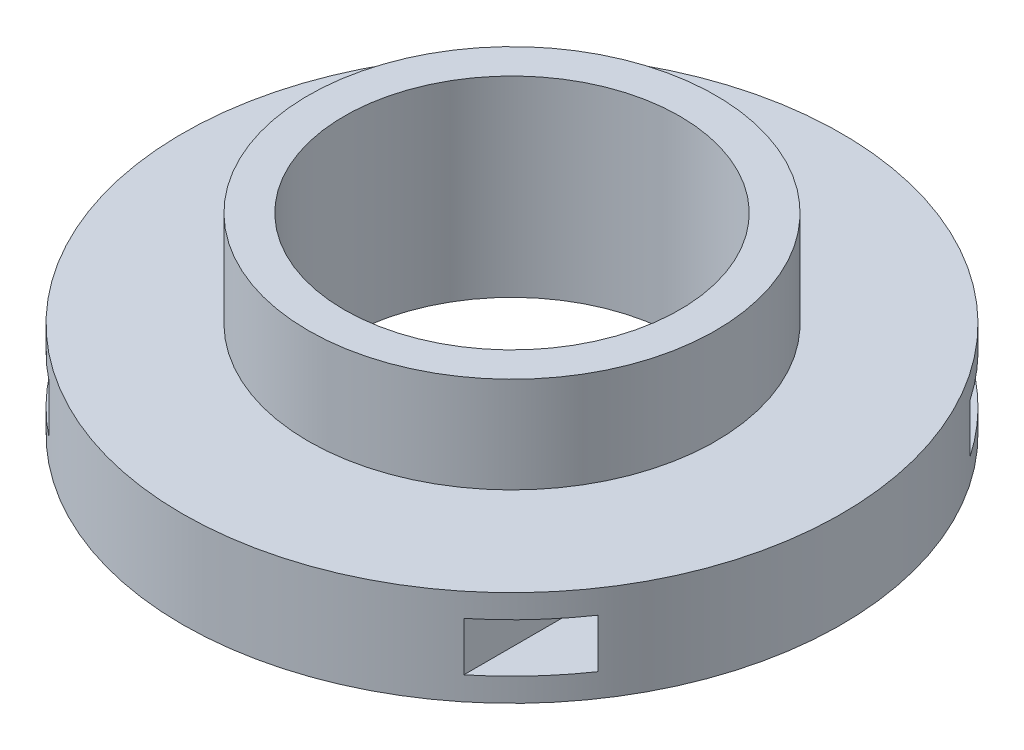
ISO-10303-21;
HEADER;
FILE_DESCRIPTION(('STEP AP214'),'2;1');
FILE_NAME('part.step','',(''),(''),'','','');
FILE_SCHEMA(('AUTOMOTIVE_DESIGN { 1 0 10303 214 1 1 1 1 }'));
ENDSEC;
DATA;
#1=APPLICATION_CONTEXT('core data for automotive mechanical design processes');
#2=APPLICATION_PROTOCOL_DEFINITION('international standard','automotive_design',2000,#1);
#3=PRODUCT_CONTEXT('',#1,'mechanical');
#4=PRODUCT('Part','Part','',(#3));
#5=PRODUCT_RELATED_PRODUCT_CATEGORY('part','',(#4));
#6=PRODUCT_DEFINITION_FORMATION('','',#4);
#7=PRODUCT_DEFINITION_CONTEXT('part definition',#1,'design');
#8=PRODUCT_DEFINITION('design','',#6,#7);
#9=PRODUCT_DEFINITION_SHAPE('','',#8);
#10=(LENGTH_UNIT() NAMED_UNIT(*) SI_UNIT(.MILLI.,.METRE.));
#11=(NAMED_UNIT(*) PLANE_ANGLE_UNIT() SI_UNIT($,.RADIAN.));
#12=(NAMED_UNIT(*) SI_UNIT($,.STERADIAN.) SOLID_ANGLE_UNIT());
#13=UNCERTAINTY_MEASURE_WITH_UNIT(LENGTH_MEASURE(1.E-05),#10,'distance_accuracy_value','');
#14=(GEOMETRIC_REPRESENTATION_CONTEXT(3) GLOBAL_UNCERTAINTY_ASSIGNED_CONTEXT((#13)) GLOBAL_UNIT_ASSIGNED_CONTEXT((#10,
#11,#12)) REPRESENTATION_CONTEXT('',''));
#15=CARTESIAN_POINT('',(0.,0.,0.));
#16=DIRECTION('',(0.,0.,1.));
#17=DIRECTION('',(1.,0.,0.));
#18=AXIS2_PLACEMENT_3D('',#15,#16,#17);
#19=CARTESIAN_POINT('',(0.,0.,0.));
#20=DIRECTION('',(0.,1.,0.));
#21=DIRECTION('',(0.,0.,1.));
#22=AXIS2_PLACEMENT_3D('',#19,#20,#21);
#23=PLANE('',#22);
#24=CARTESIAN_POINT('',(0.,0.,0.));
#25=DIRECTION('',(0.,1.,0.));
#26=DIRECTION('',(0.,0.,1.));
#27=AXIS2_PLACEMENT_3D('',#24,#25,#26);
#28=CIRCLE('',#27,13.75);
#29=CARTESIAN_POINT('',(0.,0.,13.75));
#30=VERTEX_POINT('',#29);
#31=EDGE_CURVE('E150',#30,#30,#28,.T.);
#32=ORIENTED_EDGE('',*,*,#31,.F.);
#33=EDGE_LOOP('',(#32));
#34=FACE_BOUND('',#33,.T.);
#35=CARTESIAN_POINT('',(0.,0.,0.));
#36=DIRECTION('',(0.,1.,0.));
#37=DIRECTION('',(0.,0.,1.));
#38=AXIS2_PLACEMENT_3D('',#35,#36,#37);
#39=CIRCLE('',#38,7.);
#40=CARTESIAN_POINT('',(0.,0.,7.));
#41=VERTEX_POINT('',#40);
#42=EDGE_CURVE('E131',#41,#41,#39,.T.);
#43=ORIENTED_EDGE('',*,*,#42,.T.);
#44=EDGE_LOOP('',(#43));
#45=FACE_BOUND('',#44,.T.);
#46=ADVANCED_FACE('F33',(#34,#45),#23,.F.);
#47=CARTESIAN_POINT('',(0.,7.99999999999999,0.));
#48=DIRECTION('',(0.,1.,0.));
#49=DIRECTION('',(0.,0.,1.));
#50=AXIS2_PLACEMENT_3D('',#47,#48,#49);
#51=PLANE('',#50);
#52=CARTESIAN_POINT('',(0.,7.99999999999999,0.));
#53=DIRECTION('',(0.,1.,0.));
#54=DIRECTION('',(0.,0.,1.));
#55=AXIS2_PLACEMENT_3D('',#52,#53,#54);
#56=CIRCLE('',#55,8.5);
#57=CARTESIAN_POINT('',(0.,7.99999999999999,8.5));
#58=VERTEX_POINT('',#57);
#59=EDGE_CURVE('E147',#58,#58,#56,.T.);
#60=ORIENTED_EDGE('',*,*,#59,.T.);
#61=EDGE_LOOP('',(#60));
#62=FACE_BOUND('',#61,.T.);
#63=CARTESIAN_POINT('',(0.,7.99999999999999,0.));
#64=DIRECTION('',(0.,1.,0.));
#65=DIRECTION('',(0.,0.,1.));
#66=AXIS2_PLACEMENT_3D('',#63,#64,#65);
#67=CIRCLE('',#66,7.);
#68=CARTESIAN_POINT('',(0.,7.99999999999999,7.));
#69=VERTEX_POINT('',#68);
#70=EDGE_CURVE('E37',#69,#69,#67,.F.);
#71=ORIENTED_EDGE('',*,*,#70,.T.);
#72=EDGE_LOOP('',(#71));
#73=FACE_BOUND('',#72,.T.);
#74=ADVANCED_FACE('F203',(#62,#73),#51,.T.);
#75=CARTESIAN_POINT('',(0.,4.,0.));
#76=DIRECTION('',(0.,1.,0.));
#77=DIRECTION('',(0.,0.,1.));
#78=AXIS2_PLACEMENT_3D('',#75,#76,#77);
#79=PLANE('',#78);
#80=CARTESIAN_POINT('',(0.,4.,0.));
#81=DIRECTION('',(0.,1.,0.));
#82=DIRECTION('',(0.,0.,1.));
#83=AXIS2_PLACEMENT_3D('',#80,#81,#82);
#84=CIRCLE('',#83,13.75);
#85=CARTESIAN_POINT('',(0.,4.,13.75));
#86=VERTEX_POINT('',#85);
#87=EDGE_CURVE('E153',#86,#86,#84,.T.);
#88=ORIENTED_EDGE('',*,*,#87,.T.);
#89=EDGE_LOOP('',(#88));
#90=FACE_BOUND('',#89,.T.);
#91=CARTESIAN_POINT('',(0.,4.,0.));
#92=DIRECTION('',(0.,1.,0.));
#93=DIRECTION('',(0.,0.,1.));
#94=AXIS2_PLACEMENT_3D('',#91,#92,#93);
#95=CIRCLE('',#94,8.5);
#96=CARTESIAN_POINT('',(0.,4.,8.5));
#97=VERTEX_POINT('',#96);
#98=EDGE_CURVE('E137',#97,#97,#95,.T.);
#99=ORIENTED_EDGE('',*,*,#98,.F.);
#100=EDGE_LOOP('',(#99));
#101=FACE_BOUND('',#100,.T.);
#102=ADVANCED_FACE('F208',(#90,#101),#79,.T.);
#103=CARTESIAN_POINT('',(0.,4.,0.));
#104=DIRECTION('',(0.,-1.,0.));
#105=DIRECTION('',(0.,0.,-1.));
#106=AXIS2_PLACEMENT_3D('',#103,#104,#105);
#107=CYLINDRICAL_SURFACE('',#106,13.75);
#108=CARTESIAN_POINT('',(0.,3.01991177809444,0.));
#109=DIRECTION('',(0.,1.,0.));
#110=DIRECTION('',(0.,0.,1.));
#111=AXIS2_PLACEMENT_3D('',#108,#109,#110);
#112=CIRCLE('',#111,13.75);
#113=CARTESIAN_POINT('',(11.3483899378538,3.01991177809444,-7.76379712630482));
#114=VERTEX_POINT('',#113);
#115=CARTESIAN_POINT('',(8.66604322527016,3.01991177809444,-10.6753077153658));
#116=VERTEX_POINT('',#115);
#117=EDGE_CURVE('E42',#114,#116,#112,.T.);
#118=ORIENTED_EDGE('',*,*,#117,.T.);
#119=DIRECTION('',(0.,-1.,0.));
#120=VECTOR('',#119,1.);
#121=CARTESIAN_POINT('',(8.66604322527016,4.,-10.6753077153658));
#122=LINE('',#121,#120);
#123=CARTESIAN_POINT('',(8.66604322527016,0.980088221905557,-10.6753077153658));
#124=VERTEX_POINT('',#123);
#125=EDGE_CURVE('E11',#116,#124,#122,.T.);
#126=ORIENTED_EDGE('',*,*,#125,.T.);
#127=CARTESIAN_POINT('',(0.,0.980088221905557,0.));
#128=DIRECTION('',(0.,-1.,0.));
#129=DIRECTION('',(0.,0.,-1.));
#130=AXIS2_PLACEMENT_3D('',#127,#128,#129);
#131=CIRCLE('',#130,13.75);
#132=CARTESIAN_POINT('',(11.3483899378538,0.980088221905557,-7.76379712630482));
#133=VERTEX_POINT('',#132);
#134=EDGE_CURVE('E104',#124,#133,#131,.T.);
#135=ORIENTED_EDGE('',*,*,#134,.T.);
#136=DIRECTION('',(0.,-1.,0.));
#137=VECTOR('',#136,1.);
#138=CARTESIAN_POINT('',(11.3483899378538,4.,-7.76379712630482));
#139=LINE('',#138,#137);
#140=EDGE_CURVE('E110',#133,#114,#139,.F.);
#141=ORIENTED_EDGE('',*,*,#140,.T.);
#142=EDGE_LOOP('',(#118,#126,#135,#141));
#143=FACE_BOUND('',#142,.T.);
#144=CARTESIAN_POINT('',(11.3483899378538,0.980088221905557,7.76379712630482));
#145=VERTEX_POINT('',#144);
#146=CARTESIAN_POINT('',(8.66604322527016,0.980088221905557,10.6753077153658));
#147=VERTEX_POINT('',#146);
#148=EDGE_CURVE('E96',#145,#147,#131,.T.);
#149=ORIENTED_EDGE('',*,*,#148,.T.);
#150=DIRECTION('',(0.,-1.,0.));
#151=VECTOR('',#150,1.);
#152=CARTESIAN_POINT('',(8.66604322527016,4.,10.6753077153658));
#153=LINE('',#152,#151);
#154=CARTESIAN_POINT('',(8.66604322527016,3.01991177809444,10.6753077153658));
#155=VERTEX_POINT('',#154);
#156=EDGE_CURVE('E118',#147,#155,#153,.F.);
#157=ORIENTED_EDGE('',*,*,#156,.T.);
#158=CARTESIAN_POINT('',(11.3483899378538,3.01991177809444,7.76379712630482));
#159=VERTEX_POINT('',#158);
#160=EDGE_CURVE('E116',#155,#159,#112,.T.);
#161=ORIENTED_EDGE('',*,*,#160,.T.);
#162=DIRECTION('',(0.,-1.,0.));
#163=VECTOR('',#162,1.);
#164=CARTESIAN_POINT('',(11.3483899378538,4.,7.76379712630482));
#165=LINE('',#164,#163);
#166=EDGE_CURVE('E101',#159,#145,#165,.T.);
#167=ORIENTED_EDGE('',*,*,#166,.T.);
#168=EDGE_LOOP('',(#149,#157,#161,#167));
#169=FACE_BOUND('',#168,.T.);
#170=CARTESIAN_POINT('',(0.,0.980088221905557,0.));
#171=DIRECTION('',(0.,-1.,0.));
#172=DIRECTION('',(0.,0.,-1.));
#173=AXIS2_PLACEMENT_3D('',#170,#171,#172);
#174=CIRCLE('',#173,13.75);
#175=CARTESIAN_POINT('',(-11.3999735284804,0.980088221905557,-7.68785428776757));
#176=VERTEX_POINT('',#175);
#177=CARTESIAN_POINT('',(-8.51129245339033,0.980088221905557,-10.7990925902532));
#178=VERTEX_POINT('',#177);
#179=EDGE_CURVE('E169',#176,#178,#174,.T.);
#180=ORIENTED_EDGE('',*,*,#179,.T.);
#181=DIRECTION('',(0.,-1.,0.));
#182=VECTOR('',#181,1.);
#183=CARTESIAN_POINT('',(-8.51129245339033,4.,-10.7990925902532));
#184=LINE('',#183,#182);
#185=CARTESIAN_POINT('',(-8.51129245339033,3.01991177809444,-10.7990925902532));
#186=VERTEX_POINT('',#185);
#187=EDGE_CURVE('E102',#178,#186,#184,.F.);
#188=ORIENTED_EDGE('',*,*,#187,.T.);
#189=CARTESIAN_POINT('',(0.,3.01991177809444,0.));
#190=DIRECTION('',(0.,1.,0.));
#191=DIRECTION('',(0.,0.,1.));
#192=AXIS2_PLACEMENT_3D('',#189,#190,#191);
#193=CIRCLE('',#192,13.75);
#194=CARTESIAN_POINT('',(-11.3999735284804,3.01991177809444,-7.68785428776757));
#195=VERTEX_POINT('',#194);
#196=EDGE_CURVE('E162',#186,#195,#193,.T.);
#197=ORIENTED_EDGE('',*,*,#196,.T.);
#198=DIRECTION('',(0.,-1.,0.));
#199=VECTOR('',#198,1.);
#200=CARTESIAN_POINT('',(-11.3999735284804,4.,-7.68785428776757));
#201=LINE('',#200,#199);
#202=EDGE_CURVE('E172',#195,#176,#201,.T.);
#203=ORIENTED_EDGE('',*,*,#202,.T.);
#204=EDGE_LOOP('',(#180,#188,#197,#203));
#205=FACE_BOUND('',#204,.T.);
#206=CARTESIAN_POINT('',(-11.3999735284804,3.01991177809444,7.68785428776757));
#207=VERTEX_POINT('',#206);
#208=CARTESIAN_POINT('',(-8.51129245339033,3.01991177809444,10.7990925902532));
#209=VERTEX_POINT('',#208);
#210=EDGE_CURVE('E156',#207,#209,#193,.T.);
#211=ORIENTED_EDGE('',*,*,#210,.T.);
#212=DIRECTION('',(0.,-1.,0.));
#213=VECTOR('',#212,1.);
#214=CARTESIAN_POINT('',(-8.51129245339033,4.,10.7990925902532));
#215=LINE('',#214,#213);
#216=CARTESIAN_POINT('',(-8.51129245339033,0.980088221905557,10.7990925902532));
#217=VERTEX_POINT('',#216);
#218=EDGE_CURVE('E168',#209,#217,#215,.T.);
#219=ORIENTED_EDGE('',*,*,#218,.T.);
#220=CARTESIAN_POINT('',(-11.3999735284804,0.980088221905557,7.68785428776757));
#221=VERTEX_POINT('',#220);
#222=EDGE_CURVE('E165',#217,#221,#174,.T.);
#223=ORIENTED_EDGE('',*,*,#222,.T.);
#224=DIRECTION('',(0.,-1.,0.));
#225=VECTOR('',#224,1.);
#226=CARTESIAN_POINT('',(-11.3999735284804,4.,7.68785428776757));
#227=LINE('',#226,#225);
#228=EDGE_CURVE('E161',#221,#207,#227,.F.);
#229=ORIENTED_EDGE('',*,*,#228,.T.);
#230=EDGE_LOOP('',(#211,#219,#223,#229));
#231=FACE_BOUND('',#230,.T.);
#232=ORIENTED_EDGE('',*,*,#87,.F.);
#233=EDGE_LOOP('',(#232));
#234=FACE_BOUND('',#233,.T.);
#235=ORIENTED_EDGE('',*,*,#31,.T.);
#236=EDGE_LOOP('',(#235));
#237=FACE_BOUND('',#236,.T.);
#238=ADVANCED_FACE('F35',(#143,#169,#205,#231,#234,#237),#107,.T.);
#239=CARTESIAN_POINT('',(0.,7.99999999999999,0.));
#240=DIRECTION('',(0.,-1.,0.));
#241=DIRECTION('',(0.,0.,-1.));
#242=AXIS2_PLACEMENT_3D('',#239,#240,#241);
#243=CYLINDRICAL_SURFACE('',#242,8.5);
#244=ORIENTED_EDGE('',*,*,#59,.F.);
#245=EDGE_LOOP('',(#244));
#246=FACE_BOUND('',#245,.T.);
#247=ORIENTED_EDGE('',*,*,#98,.T.);
#248=EDGE_LOOP('',(#247));
#249=FACE_BOUND('',#248,.T.);
#250=ADVANCED_FACE('F217',(#246,#249),#243,.T.);
#251=CARTESIAN_POINT('',(-8.51129245339033,0.980088221905557,-13.75));
#252=DIRECTION('',(1.,0.,0.));
#253=DIRECTION('',(0.,0.,-1.));
#254=AXIS2_PLACEMENT_3D('',#251,#252,#253);
#255=PLANE('',#254);
#256=DIRECTION('',(0.,0.,1.));
#257=VECTOR('',#256,1.);
#258=CARTESIAN_POINT('',(-8.51129245339033,3.01991177809444,-13.75));
#259=LINE('',#258,#257);
#260=EDGE_CURVE('E144',#186,#209,#259,.T.);
#261=ORIENTED_EDGE('',*,*,#260,.F.);
#262=ORIENTED_EDGE('',*,*,#187,.F.);
#263=DIRECTION('',(0.,0.,1.));
#264=VECTOR('',#263,1.);
#265=CARTESIAN_POINT('',(-8.51129245339033,0.980088221905557,-13.75));
#266=LINE('',#265,#264);
#267=EDGE_CURVE('E134',#178,#217,#266,.T.);
#268=ORIENTED_EDGE('',*,*,#267,.T.);
#269=ORIENTED_EDGE('',*,*,#218,.F.);
#270=EDGE_LOOP('',(#261,#262,#268,#269));
#271=FACE_BOUND('',#270,.T.);
#272=ADVANCED_FACE('F189',(#271),#255,.F.);
#273=CARTESIAN_POINT('',(-11.3999735284804,0.980088221905557,-13.75));
#274=DIRECTION('',(0.,-1.,0.));
#275=DIRECTION('',(0.,0.,-1.));
#276=AXIS2_PLACEMENT_3D('',#273,#274,#275);
#277=PLANE('',#276);
#278=ORIENTED_EDGE('',*,*,#267,.F.);
#279=ORIENTED_EDGE('',*,*,#179,.F.);
#280=DIRECTION('',(0.,0.,1.));
#281=VECTOR('',#280,1.);
#282=CARTESIAN_POINT('',(-11.3999735284804,0.980088221905557,-13.75));
#283=LINE('',#282,#281);
#284=EDGE_CURVE('E138',#176,#221,#283,.T.);
#285=ORIENTED_EDGE('',*,*,#284,.T.);
#286=ORIENTED_EDGE('',*,*,#222,.F.);
#287=EDGE_LOOP('',(#278,#279,#285,#286));
#288=FACE_BOUND('',#287,.T.);
#289=ADVANCED_FACE('F182',(#288),#277,.F.);
#290=CARTESIAN_POINT('',(-11.3999735284804,0.980088221905557,-13.75));
#291=DIRECTION('',(-1.,0.,0.));
#292=DIRECTION('',(0.,0.,1.));
#293=AXIS2_PLACEMENT_3D('',#290,#291,#292);
#294=PLANE('',#293);
#295=DIRECTION('',(0.,0.,1.));
#296=VECTOR('',#295,1.);
#297=CARTESIAN_POINT('',(-11.3999735284804,3.01991177809444,-13.75));
#298=LINE('',#297,#296);
#299=EDGE_CURVE('E141',#195,#207,#298,.T.);
#300=ORIENTED_EDGE('',*,*,#299,.T.);
#301=ORIENTED_EDGE('',*,*,#228,.F.);
#302=ORIENTED_EDGE('',*,*,#284,.F.);
#303=ORIENTED_EDGE('',*,*,#202,.F.);
#304=EDGE_LOOP('',(#300,#301,#302,#303));
#305=FACE_BOUND('',#304,.T.);
#306=ADVANCED_FACE('F184',(#305),#294,.F.);
#307=CARTESIAN_POINT('',(-11.3999735284804,3.01991177809444,-13.75));
#308=DIRECTION('',(0.,1.,0.));
#309=DIRECTION('',(0.,0.,1.));
#310=AXIS2_PLACEMENT_3D('',#307,#308,#309);
#311=PLANE('',#310);
#312=ORIENTED_EDGE('',*,*,#260,.T.);
#313=ORIENTED_EDGE('',*,*,#210,.F.);
#314=ORIENTED_EDGE('',*,*,#299,.F.);
#315=ORIENTED_EDGE('',*,*,#196,.F.);
#316=EDGE_LOOP('',(#312,#313,#314,#315));
#317=FACE_BOUND('',#316,.T.);
#318=ADVANCED_FACE('F191',(#317),#311,.F.);
#319=CARTESIAN_POINT('',(8.66604322527016,0.980088221905557,-13.75));
#320=DIRECTION('',(-1.,0.,0.));
#321=DIRECTION('',(0.,0.,1.));
#322=AXIS2_PLACEMENT_3D('',#319,#320,#321);
#323=PLANE('',#322);
#324=DIRECTION('',(0.,0.,1.));
#325=VECTOR('',#324,1.);
#326=CARTESIAN_POINT('',(8.66604322527016,3.01991177809444,-13.75));
#327=LINE('',#326,#325);
#328=EDGE_CURVE('E146',#116,#155,#327,.T.);
#329=ORIENTED_EDGE('',*,*,#328,.T.);
#330=ORIENTED_EDGE('',*,*,#156,.F.);
#331=DIRECTION('',(0.,0.,1.));
#332=VECTOR('',#331,1.);
#333=CARTESIAN_POINT('',(8.66604322527016,0.980088221905557,-13.75));
#334=LINE('',#333,#332);
#335=EDGE_CURVE('E54',#124,#147,#334,.T.);
#336=ORIENTED_EDGE('',*,*,#335,.F.);
#337=ORIENTED_EDGE('',*,*,#125,.F.);
#338=EDGE_LOOP('',(#329,#330,#336,#337));
#339=FACE_BOUND('',#338,.T.);
#340=ADVANCED_FACE('F127',(#339),#323,.F.);
#341=CARTESIAN_POINT('',(11.3483899378538,3.01991177809444,-13.75));
#342=DIRECTION('',(0.,1.,0.));
#343=DIRECTION('',(0.,0.,1.));
#344=AXIS2_PLACEMENT_3D('',#341,#342,#343);
#345=PLANE('',#344);
#346=ORIENTED_EDGE('',*,*,#328,.F.);
#347=ORIENTED_EDGE('',*,*,#117,.F.);
#348=DIRECTION('',(0.,0.,1.));
#349=VECTOR('',#348,1.);
#350=CARTESIAN_POINT('',(11.3483899378538,3.01991177809444,-13.75));
#351=LINE('',#350,#349);
#352=EDGE_CURVE('E112',#114,#159,#351,.T.);
#353=ORIENTED_EDGE('',*,*,#352,.T.);
#354=ORIENTED_EDGE('',*,*,#160,.F.);
#355=EDGE_LOOP('',(#346,#347,#353,#354));
#356=FACE_BOUND('',#355,.T.);
#357=ADVANCED_FACE('F198',(#356),#345,.F.);
#358=CARTESIAN_POINT('',(11.3483899378538,0.980088221905557,-13.75));
#359=DIRECTION('',(1.,0.,0.));
#360=DIRECTION('',(0.,0.,-1.));
#361=AXIS2_PLACEMENT_3D('',#358,#359,#360);
#362=PLANE('',#361);
#363=ORIENTED_EDGE('',*,*,#352,.F.);
#364=ORIENTED_EDGE('',*,*,#140,.F.);
#365=DIRECTION('',(0.,0.,1.));
#366=VECTOR('',#365,1.);
#367=CARTESIAN_POINT('',(11.3483899378538,0.980088221905557,-13.75));
#368=LINE('',#367,#366);
#369=EDGE_CURVE('E49',#133,#145,#368,.T.);
#370=ORIENTED_EDGE('',*,*,#369,.T.);
#371=ORIENTED_EDGE('',*,*,#166,.F.);
#372=EDGE_LOOP('',(#363,#364,#370,#371));
#373=FACE_BOUND('',#372,.T.);
#374=ADVANCED_FACE('F107',(#373),#362,.F.);
#375=CARTESIAN_POINT('',(11.3483899378538,0.980088221905557,-13.75));
#376=DIRECTION('',(0.,-1.,0.));
#377=DIRECTION('',(0.,0.,-1.));
#378=AXIS2_PLACEMENT_3D('',#375,#376,#377);
#379=PLANE('',#378);
#380=ORIENTED_EDGE('',*,*,#335,.T.);
#381=ORIENTED_EDGE('',*,*,#148,.F.);
#382=ORIENTED_EDGE('',*,*,#369,.F.);
#383=ORIENTED_EDGE('',*,*,#134,.F.);
#384=EDGE_LOOP('',(#380,#381,#382,#383));
#385=FACE_BOUND('',#384,.T.);
#386=ADVANCED_FACE('F97',(#385),#379,.F.);
#387=CARTESIAN_POINT('',(0.,12.,0.));
#388=DIRECTION('',(0.,-1.,0.));
#389=DIRECTION('',(0.,0.,-1.));
#390=AXIS2_PLACEMENT_3D('',#387,#388,#389);
#391=CYLINDRICAL_SURFACE('',#390,7.);
#392=ORIENTED_EDGE('',*,*,#70,.F.);
#393=EDGE_LOOP('',(#392));
#394=FACE_BOUND('',#393,.T.);
#395=ORIENTED_EDGE('',*,*,#42,.F.);
#396=EDGE_LOOP('',(#395));
#397=FACE_BOUND('',#396,.T.);
#398=ADVANCED_FACE('F230',(#394,#397),#391,.F.);
#399=CLOSED_SHELL('',(#46,#74,#102,#238,#250,#272,#289,#306,#318,#340,#357,#374,#386,#398));
#400=MANIFOLD_SOLID_BREP('B2',#399);
#401=ADVANCED_BREP_SHAPE_REPRESENTATION('',(#18,#400),#14);
#402=SHAPE_DEFINITION_REPRESENTATION(#9,#401);
ENDSEC;
END-ISO-10303-21;
